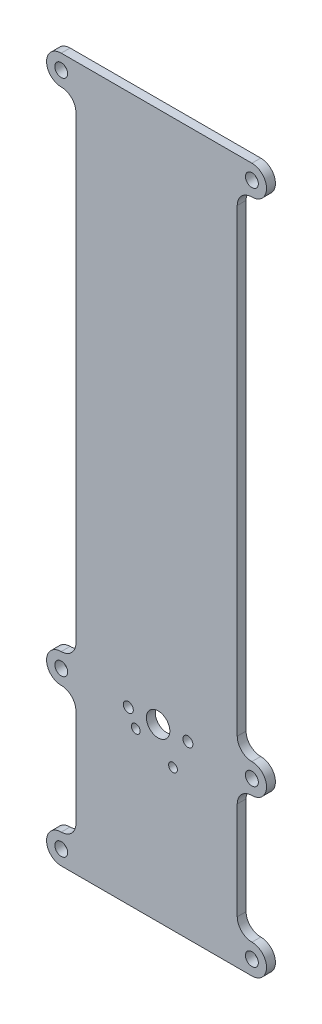
ISO-10303-21;
HEADER;
FILE_DESCRIPTION(('STEP AP214'),'2;1');
FILE_NAME('part.step','',(''),(''),'','','');
FILE_SCHEMA(('AUTOMOTIVE_DESIGN { 1 0 10303 214 1 1 1 1 }'));
ENDSEC;
DATA;
#1=APPLICATION_CONTEXT('core data for automotive mechanical design processes');
#2=APPLICATION_PROTOCOL_DEFINITION('international standard','automotive_design',2000,#1);
#3=PRODUCT_CONTEXT('',#1,'mechanical');
#4=PRODUCT('Part','Part','',(#3));
#5=PRODUCT_RELATED_PRODUCT_CATEGORY('part','',(#4));
#6=PRODUCT_DEFINITION_FORMATION('','',#4);
#7=PRODUCT_DEFINITION_CONTEXT('part definition',#1,'design');
#8=PRODUCT_DEFINITION('design','',#6,#7);
#9=PRODUCT_DEFINITION_SHAPE('','',#8);
#10=(LENGTH_UNIT() NAMED_UNIT(*) SI_UNIT(.MILLI.,.METRE.));
#11=(NAMED_UNIT(*) PLANE_ANGLE_UNIT() SI_UNIT($,.RADIAN.));
#12=(NAMED_UNIT(*) SI_UNIT($,.STERADIAN.) SOLID_ANGLE_UNIT());
#13=UNCERTAINTY_MEASURE_WITH_UNIT(LENGTH_MEASURE(1.E-05),#10,'distance_accuracy_value','');
#14=(GEOMETRIC_REPRESENTATION_CONTEXT(3) GLOBAL_UNCERTAINTY_ASSIGNED_CONTEXT((#13)) GLOBAL_UNIT_ASSIGNED_CONTEXT((#10,
#11,#12)) REPRESENTATION_CONTEXT('',''));
#15=CARTESIAN_POINT('',(0.,0.,0.));
#16=DIRECTION('',(0.,0.,1.));
#17=DIRECTION('',(1.,0.,0.));
#18=AXIS2_PLACEMENT_3D('',#15,#16,#17);
#19=CARTESIAN_POINT('',(136.512,-49.1938,-127.232909606827));
#20=DIRECTION('',(0.,0.,1.));
#21=DIRECTION('',(1.,0.,0.));
#22=AXIS2_PLACEMENT_3D('',#19,#20,#21);
#23=CYLINDRICAL_SURFACE('',#22,2.5);
#24=CARTESIAN_POINT('',(136.512,-49.1938,-1.51000000000001));
#25=DIRECTION('',(0.,0.,1.));
#26=DIRECTION('',(1.,0.,0.));
#27=AXIS2_PLACEMENT_3D('',#24,#25,#26);
#28=CIRCLE('',#27,2.5);
#29=CARTESIAN_POINT('',(136.512,-46.6938,-1.51000000000001));
#30=VERTEX_POINT('',#29);
#31=CARTESIAN_POINT('',(136.512,-51.6938,-1.51000000000001));
#32=VERTEX_POINT('',#31);
#33=EDGE_CURVE('E123',#30,#32,#28,.F.);
#34=ORIENTED_EDGE('',*,*,#33,.F.);
#35=DIRECTION('',(0.,0.,1.));
#36=VECTOR('',#35,1.);
#37=CARTESIAN_POINT('',(136.512,-46.6938,-127.232909606827));
#38=LINE('',#37,#36);
#39=CARTESIAN_POINT('',(136.512,-46.6938,0.));
#40=VERTEX_POINT('',#39);
#41=EDGE_CURVE('E199',#30,#40,#38,.T.);
#42=ORIENTED_EDGE('',*,*,#41,.T.);
#43=CARTESIAN_POINT('',(136.512,-49.1938,0.));
#44=DIRECTION('',(0.,0.,1.));
#45=DIRECTION('',(1.,0.,0.));
#46=AXIS2_PLACEMENT_3D('',#43,#44,#45);
#47=CIRCLE('',#46,2.5);
#48=CARTESIAN_POINT('',(136.512,-51.6938,0.));
#49=VERTEX_POINT('',#48);
#50=EDGE_CURVE('E202',#49,#40,#47,.T.);
#51=ORIENTED_EDGE('',*,*,#50,.F.);
#52=DIRECTION('',(0.,0.,1.));
#53=VECTOR('',#52,1.);
#54=CARTESIAN_POINT('',(136.512,-51.6938,-127.232909606827));
#55=LINE('',#54,#53);
#56=EDGE_CURVE('E192',#32,#49,#55,.T.);
#57=ORIENTED_EDGE('',*,*,#56,.F.);
#58=EDGE_LOOP('',(#34,#42,#51,#57));
#59=FACE_BOUND('',#58,.T.);
#60=ADVANCED_FACE('F45',(#59),#23,.T.);
#61=CARTESIAN_POINT('',(136.512,-46.6938,-127.232909606827));
#62=DIRECTION('',(0.,1.,0.));
#63=DIRECTION('',(-1.,0.,0.));
#64=AXIS2_PLACEMENT_3D('',#61,#62,#63);
#65=PLANE('',#64);
#66=DIRECTION('',(1.,0.,0.));
#67=VECTOR('',#66,1.);
#68=CARTESIAN_POINT('',(136.512,-46.6938,-1.51000000000001));
#69=LINE('',#68,#67);
#70=CARTESIAN_POINT('',(104.012,-46.6938,-1.51000000000001));
#71=VERTEX_POINT('',#70);
#72=EDGE_CURVE('E125',#71,#30,#69,.T.);
#73=ORIENTED_EDGE('',*,*,#72,.F.);
#74=DIRECTION('',(0.,0.,1.));
#75=VECTOR('',#74,1.);
#76=CARTESIAN_POINT('',(104.012,-46.6938,-127.232909606827));
#77=LINE('',#76,#75);
#78=CARTESIAN_POINT('',(104.012,-46.6938,0.));
#79=VERTEX_POINT('',#78);
#80=EDGE_CURVE('E337',#71,#79,#77,.T.);
#81=ORIENTED_EDGE('',*,*,#80,.T.);
#82=DIRECTION('',(-1.,0.,0.));
#83=VECTOR('',#82,1.);
#84=CARTESIAN_POINT('',(136.512,-46.6938,0.));
#85=LINE('',#84,#83);
#86=EDGE_CURVE('E207',#40,#79,#85,.T.);
#87=ORIENTED_EDGE('',*,*,#86,.F.);
#88=ORIENTED_EDGE('',*,*,#41,.F.);
#89=EDGE_LOOP('',(#73,#81,#87,#88));
#90=FACE_BOUND('',#89,.T.);
#91=ADVANCED_FACE('F499',(#90),#65,.T.);
#92=CARTESIAN_POINT('',(104.012,-49.1938,-127.232909606827));
#93=DIRECTION('',(0.,0.,1.));
#94=DIRECTION('',(1.,0.,0.));
#95=AXIS2_PLACEMENT_3D('',#92,#93,#94);
#96=CYLINDRICAL_SURFACE('',#95,2.5);
#97=CARTESIAN_POINT('',(104.012,-49.1938,-1.51000000000001));
#98=DIRECTION('',(0.,0.,1.));
#99=DIRECTION('',(1.,0.,0.));
#100=AXIS2_PLACEMENT_3D('',#97,#98,#99);
#101=CIRCLE('',#100,2.5);
#102=CARTESIAN_POINT('',(104.012,-51.6938,-1.51000000000001));
#103=VERTEX_POINT('',#102);
#104=EDGE_CURVE('E120',#103,#71,#101,.F.);
#105=ORIENTED_EDGE('',*,*,#104,.F.);
#106=DIRECTION('',(0.,0.,1.));
#107=VECTOR('',#106,1.);
#108=CARTESIAN_POINT('',(104.012,-51.6938,-127.232909606827));
#109=LINE('',#108,#107);
#110=CARTESIAN_POINT('',(104.012,-51.6938,0.));
#111=VERTEX_POINT('',#110);
#112=EDGE_CURVE('E334',#103,#111,#109,.T.);
#113=ORIENTED_EDGE('',*,*,#112,.T.);
#114=CARTESIAN_POINT('',(104.012,-49.1938,0.));
#115=DIRECTION('',(0.,0.,1.));
#116=DIRECTION('',(1.,0.,0.));
#117=AXIS2_PLACEMENT_3D('',#114,#115,#116);
#118=CIRCLE('',#117,2.5);
#119=EDGE_CURVE('E222',#79,#111,#118,.T.);
#120=ORIENTED_EDGE('',*,*,#119,.F.);
#121=ORIENTED_EDGE('',*,*,#80,.F.);
#122=EDGE_LOOP('',(#105,#113,#120,#121));
#123=FACE_BOUND('',#122,.T.);
#124=ADVANCED_FACE('F503',(#123),#96,.T.);
#125=CARTESIAN_POINT('',(104.01200016058,-54.19379983941,-127.232909606827));
#126=DIRECTION('',(0.,0.,1.));
#127=DIRECTION('',(1.,0.,0.));
#128=AXIS2_PLACEMENT_3D('',#125,#126,#127);
#129=CYLINDRICAL_SURFACE('',#128,2.49999983941251);
#130=CARTESIAN_POINT('',(104.01200016058,-54.19379983941,-1.51000000000001));
#131=DIRECTION('',(0.,0.,1.));
#132=DIRECTION('',(1.,0.,0.));
#133=AXIS2_PLACEMENT_3D('',#130,#131,#132);
#134=CIRCLE('',#133,2.49999983941251);
#135=CARTESIAN_POINT('',(106.511999999992,-54.19379983941,-1.51000000000001));
#136=VERTEX_POINT('',#135);
#137=EDGE_CURVE('E345',#136,#103,#134,.T.);
#138=ORIENTED_EDGE('',*,*,#137,.F.);
#139=DIRECTION('',(0.,0.,1.));
#140=VECTOR('',#139,1.);
#141=CARTESIAN_POINT('',(106.511999999992,-54.1938,-127.232909606827));
#142=LINE('',#141,#140);
#143=CARTESIAN_POINT('',(106.511999999992,-54.1938,0.));
#144=VERTEX_POINT('',#143);
#145=EDGE_CURVE('E331',#136,#144,#142,.T.);
#146=ORIENTED_EDGE('',*,*,#145,.T.);
#147=CARTESIAN_POINT('',(104.01200016058,-54.19379983941,0.));
#148=DIRECTION('',(0.,0.,-1.));
#149=DIRECTION('',(1.,0.,0.));
#150=AXIS2_PLACEMENT_3D('',#147,#148,#149);
#151=CIRCLE('',#150,2.49999983941251);
#152=EDGE_CURVE('E226',#111,#144,#151,.T.);
#153=ORIENTED_EDGE('',*,*,#152,.F.);
#154=ORIENTED_EDGE('',*,*,#112,.F.);
#155=EDGE_LOOP('',(#138,#146,#153,#154));
#156=FACE_BOUND('',#155,.T.);
#157=ADVANCED_FACE('F509',(#156),#129,.F.);
#158=CARTESIAN_POINT('',(106.511999999995,-54.1938,-127.232909606827));
#159=DIRECTION('',(-1.,0.,0.));
#160=DIRECTION('',(0.,-1.,0.));
#161=AXIS2_PLACEMENT_3D('',#158,#159,#160);
#162=PLANE('',#161);
#163=DIRECTION('',(0.,1.,0.));
#164=VECTOR('',#163,1.);
#165=CARTESIAN_POINT('',(106.511999999995,-54.1938,-1.51000000000001));
#166=LINE('',#165,#164);
#167=CARTESIAN_POINT('',(106.512,-132.541,-1.51000000000001));
#168=VERTEX_POINT('',#167);
#169=EDGE_CURVE('E348',#168,#136,#166,.T.);
#170=ORIENTED_EDGE('',*,*,#169,.F.);
#171=DIRECTION('',(0.,0.,1.));
#172=VECTOR('',#171,1.);
#173=CARTESIAN_POINT('',(106.512,-132.541,-127.232909606827));
#174=LINE('',#173,#172);
#175=CARTESIAN_POINT('',(106.512,-132.541,0.));
#176=VERTEX_POINT('',#175);
#177=EDGE_CURVE('E328',#168,#176,#174,.T.);
#178=ORIENTED_EDGE('',*,*,#177,.T.);
#179=DIRECTION('',(0.,-1.,0.));
#180=VECTOR('',#179,1.);
#181=CARTESIAN_POINT('',(106.511999999995,-54.1938,0.));
#182=LINE('',#181,#180);
#183=EDGE_CURVE('E230',#144,#176,#182,.T.);
#184=ORIENTED_EDGE('',*,*,#183,.F.);
#185=ORIENTED_EDGE('',*,*,#145,.F.);
#186=EDGE_LOOP('',(#170,#178,#184,#185));
#187=FACE_BOUND('',#186,.T.);
#188=ADVANCED_FACE('F513',(#187),#162,.T.);
#189=CARTESIAN_POINT('',(104.01200016058,-132.5410001605,-127.232909606827));
#190=DIRECTION('',(0.,0.,1.));
#191=DIRECTION('',(1.,0.,0.));
#192=AXIS2_PLACEMENT_3D('',#189,#190,#191);
#193=CYLINDRICAL_SURFACE('',#192,2.49999983944);
#194=CARTESIAN_POINT('',(104.01200016058,-132.5410001605,-1.51000000000001));
#195=DIRECTION('',(0.,0.,1.));
#196=DIRECTION('',(1.,0.,0.));
#197=AXIS2_PLACEMENT_3D('',#194,#195,#196);
#198=CIRCLE('',#197,2.49999983944);
#199=CARTESIAN_POINT('',(104.012,-135.04099999994,-1.51000000000001));
#200=VERTEX_POINT('',#199);
#201=EDGE_CURVE('E351',#200,#168,#198,.T.);
#202=ORIENTED_EDGE('',*,*,#201,.F.);
#203=DIRECTION('',(0.,0.,1.));
#204=VECTOR('',#203,1.);
#205=CARTESIAN_POINT('',(104.012,-135.04099999994,-127.232909606827));
#206=LINE('',#205,#204);
#207=CARTESIAN_POINT('',(104.012,-135.04099999994,0.));
#208=VERTEX_POINT('',#207);
#209=EDGE_CURVE('E325',#200,#208,#206,.T.);
#210=ORIENTED_EDGE('',*,*,#209,.T.);
#211=CARTESIAN_POINT('',(104.01200016058,-132.5410001605,0.));
#212=DIRECTION('',(0.,0.,-1.));
#213=DIRECTION('',(1.,0.,0.));
#214=AXIS2_PLACEMENT_3D('',#211,#212,#213);
#215=CIRCLE('',#214,2.49999983944);
#216=EDGE_CURVE('E234',#176,#208,#215,.T.);
#217=ORIENTED_EDGE('',*,*,#216,.F.);
#218=ORIENTED_EDGE('',*,*,#177,.F.);
#219=EDGE_LOOP('',(#202,#210,#217,#218));
#220=FACE_BOUND('',#219,.T.);
#221=ADVANCED_FACE('F517',(#220),#193,.F.);
#222=CARTESIAN_POINT('',(104.012,-137.541,-127.232909606827));
#223=DIRECTION('',(0.,0.,1.));
#224=DIRECTION('',(1.,0.,0.));
#225=AXIS2_PLACEMENT_3D('',#222,#223,#224);
#226=CYLINDRICAL_SURFACE('',#225,2.50000000002);
#227=CARTESIAN_POINT('',(104.012,-137.541,-1.51000000000001));
#228=DIRECTION('',(0.,0.,1.));
#229=DIRECTION('',(1.,0.,0.));
#230=AXIS2_PLACEMENT_3D('',#227,#228,#229);
#231=CIRCLE('',#230,2.50000000002);
#232=CARTESIAN_POINT('',(104.012,-140.04100000002,-1.51000000000001));
#233=VERTEX_POINT('',#232);
#234=EDGE_CURVE('E354',#233,#200,#231,.F.);
#235=ORIENTED_EDGE('',*,*,#234,.F.);
#236=DIRECTION('',(0.,0.,1.));
#237=VECTOR('',#236,1.);
#238=CARTESIAN_POINT('',(104.012,-140.04100000002,-127.232909606827));
#239=LINE('',#238,#237);
#240=CARTESIAN_POINT('',(104.012,-140.04100000002,0.));
#241=VERTEX_POINT('',#240);
#242=EDGE_CURVE('E322',#233,#241,#239,.T.);
#243=ORIENTED_EDGE('',*,*,#242,.T.);
#244=CARTESIAN_POINT('',(104.012,-137.541,0.));
#245=DIRECTION('',(0.,0.,1.));
#246=DIRECTION('',(1.,0.,0.));
#247=AXIS2_PLACEMENT_3D('',#244,#245,#246);
#248=CIRCLE('',#247,2.50000000002);
#249=EDGE_CURVE('E238',#208,#241,#248,.T.);
#250=ORIENTED_EDGE('',*,*,#249,.F.);
#251=ORIENTED_EDGE('',*,*,#209,.F.);
#252=EDGE_LOOP('',(#235,#243,#250,#251));
#253=FACE_BOUND('',#252,.T.);
#254=ADVANCED_FACE('F521',(#253),#226,.T.);
#255=CARTESIAN_POINT('',(104.01200016058,-142.5409998394,-127.232909606827));
#256=DIRECTION('',(0.,0.,1.));
#257=DIRECTION('',(1.,0.,0.));
#258=AXIS2_PLACEMENT_3D('',#255,#256,#257);
#259=CYLINDRICAL_SURFACE('',#258,2.49999983940502);
#260=CARTESIAN_POINT('',(104.01200016058,-142.5409998394,-1.51000000000001));
#261=DIRECTION('',(0.,0.,1.));
#262=DIRECTION('',(1.,0.,0.));
#263=AXIS2_PLACEMENT_3D('',#260,#261,#262);
#264=CIRCLE('',#263,2.49999983940502);
#265=CARTESIAN_POINT('',(106.511999999985,-142.5409998394,-1.51000000000001));
#266=VERTEX_POINT('',#265);
#267=EDGE_CURVE('E357',#266,#233,#264,.T.);
#268=ORIENTED_EDGE('',*,*,#267,.F.);
#269=DIRECTION('',(0.,0.,1.));
#270=VECTOR('',#269,1.);
#271=CARTESIAN_POINT('',(106.511999999985,-142.541,-127.232909606827));
#272=LINE('',#271,#270);
#273=CARTESIAN_POINT('',(106.511999999985,-142.541,0.));
#274=VERTEX_POINT('',#273);
#275=EDGE_CURVE('E319',#266,#274,#272,.T.);
#276=ORIENTED_EDGE('',*,*,#275,.T.);
#277=CARTESIAN_POINT('',(104.01200016058,-142.5409998394,0.));
#278=DIRECTION('',(0.,0.,-1.));
#279=DIRECTION('',(1.,0.,0.));
#280=AXIS2_PLACEMENT_3D('',#277,#278,#279);
#281=CIRCLE('',#280,2.49999983940502);
#282=EDGE_CURVE('E242',#241,#274,#281,.T.);
#283=ORIENTED_EDGE('',*,*,#282,.F.);
#284=ORIENTED_EDGE('',*,*,#242,.F.);
#285=EDGE_LOOP('',(#268,#276,#283,#284));
#286=FACE_BOUND('',#285,.T.);
#287=ADVANCED_FACE('F525',(#286),#259,.F.);
#288=CARTESIAN_POINT('',(106.51199999999,-142.541,-127.232909606827));
#289=DIRECTION('',(-1.,-6.0001964964609E-13,0.));
#290=DIRECTION('',(6.0001964964609E-13,-1.,0.));
#291=AXIS2_PLACEMENT_3D('',#288,#289,#290);
#292=PLANE('',#291);
#293=DIRECTION('',(-6.0001964964609E-13,1.,0.));
#294=VECTOR('',#293,1.);
#295=CARTESIAN_POINT('',(106.51199999999,-142.541,-1.51000000000001));
#296=LINE('',#295,#294);
#297=CARTESIAN_POINT('',(106.512,-159.1938,-1.51000000000001));
#298=VERTEX_POINT('',#297);
#299=EDGE_CURVE('E360',#298,#266,#296,.T.);
#300=ORIENTED_EDGE('',*,*,#299,.F.);
#301=DIRECTION('',(0.,0.,1.));
#302=VECTOR('',#301,1.);
#303=CARTESIAN_POINT('',(106.512,-159.1938,-127.232909606827));
#304=LINE('',#303,#302);
#305=CARTESIAN_POINT('',(106.512,-159.1938,0.));
#306=VERTEX_POINT('',#305);
#307=EDGE_CURVE('E316',#298,#306,#304,.T.);
#308=ORIENTED_EDGE('',*,*,#307,.T.);
#309=DIRECTION('',(6.0001964964609E-13,-1.,0.));
#310=VECTOR('',#309,1.);
#311=CARTESIAN_POINT('',(106.51199999999,-142.541,0.));
#312=LINE('',#311,#310);
#313=EDGE_CURVE('E246',#274,#306,#312,.T.);
#314=ORIENTED_EDGE('',*,*,#313,.F.);
#315=ORIENTED_EDGE('',*,*,#275,.F.);
#316=EDGE_LOOP('',(#300,#308,#314,#315));
#317=FACE_BOUND('',#316,.T.);
#318=ADVANCED_FACE('F529',(#317),#292,.T.);
#319=CARTESIAN_POINT('',(104.01200016058,-159.1938001605,-127.232909606827));
#320=DIRECTION('',(0.,0.,1.));
#321=DIRECTION('',(1.,0.,0.));
#322=AXIS2_PLACEMENT_3D('',#319,#320,#321);
#323=CYLINDRICAL_SURFACE('',#322,2.49999983944);
#324=CARTESIAN_POINT('',(104.01200016058,-159.1938001605,-1.51000000000001));
#325=DIRECTION('',(0.,0.,1.));
#326=DIRECTION('',(1.,0.,0.));
#327=AXIS2_PLACEMENT_3D('',#324,#325,#326);
#328=CIRCLE('',#327,2.49999983944);
#329=CARTESIAN_POINT('',(104.012,-161.69379999994,-1.51000000000001));
#330=VERTEX_POINT('',#329);
#331=EDGE_CURVE('E363',#330,#298,#328,.T.);
#332=ORIENTED_EDGE('',*,*,#331,.F.);
#333=DIRECTION('',(0.,0.,1.));
#334=VECTOR('',#333,1.);
#335=CARTESIAN_POINT('',(104.012,-161.69379999994,-127.232909606827));
#336=LINE('',#335,#334);
#337=CARTESIAN_POINT('',(104.012,-161.69379999994,0.));
#338=VERTEX_POINT('',#337);
#339=EDGE_CURVE('E313',#330,#338,#336,.T.);
#340=ORIENTED_EDGE('',*,*,#339,.T.);
#341=CARTESIAN_POINT('',(104.01200016058,-159.1938001605,0.));
#342=DIRECTION('',(0.,0.,-1.));
#343=DIRECTION('',(1.,0.,0.));
#344=AXIS2_PLACEMENT_3D('',#341,#342,#343);
#345=CIRCLE('',#344,2.49999983944);
#346=EDGE_CURVE('E250',#306,#338,#345,.T.);
#347=ORIENTED_EDGE('',*,*,#346,.F.);
#348=ORIENTED_EDGE('',*,*,#307,.F.);
#349=EDGE_LOOP('',(#332,#340,#347,#348));
#350=FACE_BOUND('',#349,.T.);
#351=ADVANCED_FACE('F533',(#350),#323,.F.);
#352=CARTESIAN_POINT('',(104.012,-164.1938,-127.232909606827));
#353=DIRECTION('',(0.,0.,1.));
#354=DIRECTION('',(1.,0.,0.));
#355=AXIS2_PLACEMENT_3D('',#352,#353,#354);
#356=CYLINDRICAL_SURFACE('',#355,2.50000000002);
#357=CARTESIAN_POINT('',(104.012,-164.1938,-1.51000000000001));
#358=DIRECTION('',(0.,0.,1.));
#359=DIRECTION('',(1.,0.,0.));
#360=AXIS2_PLACEMENT_3D('',#357,#358,#359);
#361=CIRCLE('',#360,2.50000000002);
#362=CARTESIAN_POINT('',(104.012,-166.69380000002,-1.51000000000001));
#363=VERTEX_POINT('',#362);
#364=EDGE_CURVE('E366',#363,#330,#361,.F.);
#365=ORIENTED_EDGE('',*,*,#364,.F.);
#366=DIRECTION('',(0.,0.,1.));
#367=VECTOR('',#366,1.);
#368=CARTESIAN_POINT('',(104.012,-166.69380000002,-127.232909606827));
#369=LINE('',#368,#367);
#370=CARTESIAN_POINT('',(104.012,-166.69380000002,0.));
#371=VERTEX_POINT('',#370);
#372=EDGE_CURVE('E310',#363,#371,#369,.T.);
#373=ORIENTED_EDGE('',*,*,#372,.T.);
#374=CARTESIAN_POINT('',(104.012,-164.1938,0.));
#375=DIRECTION('',(0.,0.,1.));
#376=DIRECTION('',(1.,0.,0.));
#377=AXIS2_PLACEMENT_3D('',#374,#375,#376);
#378=CIRCLE('',#377,2.50000000002);
#379=EDGE_CURVE('E254',#338,#371,#378,.T.);
#380=ORIENTED_EDGE('',*,*,#379,.F.);
#381=ORIENTED_EDGE('',*,*,#339,.F.);
#382=EDGE_LOOP('',(#365,#373,#380,#381));
#383=FACE_BOUND('',#382,.T.);
#384=ADVANCED_FACE('F537',(#383),#356,.T.);
#385=CARTESIAN_POINT('',(104.012,-166.6938,-127.232909606827));
#386=DIRECTION('',(0.,-1.,0.));
#387=DIRECTION('',(0.,0.,-1.));
#388=AXIS2_PLACEMENT_3D('',#385,#386,#387);
#389=PLANE('',#388);
#390=DIRECTION('',(-1.,0.,0.));
#391=VECTOR('',#390,1.);
#392=CARTESIAN_POINT('',(104.012,-166.6938,-1.51000000000001));
#393=LINE('',#392,#391);
#394=CARTESIAN_POINT('',(136.512,-166.6938,-1.51000000000001));
#395=VERTEX_POINT('',#394);
#396=EDGE_CURVE('E369',#395,#363,#393,.T.);
#397=ORIENTED_EDGE('',*,*,#396,.F.);
#398=DIRECTION('',(0.,0.,1.));
#399=VECTOR('',#398,1.);
#400=CARTESIAN_POINT('',(136.512,-166.6938,-127.232909606827));
#401=LINE('',#400,#399);
#402=CARTESIAN_POINT('',(136.512,-166.6938,0.));
#403=VERTEX_POINT('',#402);
#404=EDGE_CURVE('E307',#395,#403,#401,.T.);
#405=ORIENTED_EDGE('',*,*,#404,.T.);
#406=DIRECTION('',(1.,0.,0.));
#407=VECTOR('',#406,1.);
#408=CARTESIAN_POINT('',(104.012,-166.6938,0.));
#409=LINE('',#408,#407);
#410=EDGE_CURVE('E258',#371,#403,#409,.T.);
#411=ORIENTED_EDGE('',*,*,#410,.F.);
#412=ORIENTED_EDGE('',*,*,#372,.F.);
#413=EDGE_LOOP('',(#397,#405,#411,#412));
#414=FACE_BOUND('',#413,.T.);
#415=ADVANCED_FACE('F541',(#414),#389,.T.);
#416=CARTESIAN_POINT('',(136.512,-164.1938,-127.232909606827));
#417=DIRECTION('',(0.,0.,1.));
#418=DIRECTION('',(1.,0.,0.));
#419=AXIS2_PLACEMENT_3D('',#416,#417,#418);
#420=CYLINDRICAL_SURFACE('',#419,2.5);
#421=CARTESIAN_POINT('',(136.512,-164.1938,-1.51000000000001));
#422=DIRECTION('',(0.,0.,1.));
#423=DIRECTION('',(1.,0.,0.));
#424=AXIS2_PLACEMENT_3D('',#421,#422,#423);
#425=CIRCLE('',#424,2.5);
#426=CARTESIAN_POINT('',(136.512,-161.6938,-1.51000000000001));
#427=VERTEX_POINT('',#426);
#428=EDGE_CURVE('E372',#427,#395,#425,.F.);
#429=ORIENTED_EDGE('',*,*,#428,.F.);
#430=DIRECTION('',(0.,0.,1.));
#431=VECTOR('',#430,1.);
#432=CARTESIAN_POINT('',(136.512,-161.6938,-127.232909606827));
#433=LINE('',#432,#431);
#434=CARTESIAN_POINT('',(136.512,-161.6938,0.));
#435=VERTEX_POINT('',#434);
#436=EDGE_CURVE('E304',#427,#435,#433,.T.);
#437=ORIENTED_EDGE('',*,*,#436,.T.);
#438=CARTESIAN_POINT('',(136.512,-164.1938,0.));
#439=DIRECTION('',(0.,0.,1.));
#440=DIRECTION('',(1.,0.,0.));
#441=AXIS2_PLACEMENT_3D('',#438,#439,#440);
#442=CIRCLE('',#441,2.5);
#443=EDGE_CURVE('E262',#403,#435,#442,.T.);
#444=ORIENTED_EDGE('',*,*,#443,.F.);
#445=ORIENTED_EDGE('',*,*,#404,.F.);
#446=EDGE_LOOP('',(#429,#437,#444,#445));
#447=FACE_BOUND('',#446,.T.);
#448=ADVANCED_FACE('F545',(#447),#420,.T.);
#449=CARTESIAN_POINT('',(136.51199983941,-159.1938001605,-127.232909606827));
#450=DIRECTION('',(0.,0.,1.));
#451=DIRECTION('',(1.,0.,0.));
#452=AXIS2_PLACEMENT_3D('',#449,#450,#451);
#453=CYLINDRICAL_SURFACE('',#452,2.49999983947751);
#454=CARTESIAN_POINT('',(136.51199983941,-159.1938001605,-1.51000000000001));
#455=DIRECTION('',(0.,0.,1.));
#456=DIRECTION('',(1.,0.,0.));
#457=AXIS2_PLACEMENT_3D('',#454,#455,#456);
#458=CIRCLE('',#457,2.49999983947751);
#459=CARTESIAN_POINT('',(134.011999999933,-159.1938,-1.51000000000001));
#460=VERTEX_POINT('',#459);
#461=EDGE_CURVE('E375',#460,#427,#458,.T.);
#462=ORIENTED_EDGE('',*,*,#461,.F.);
#463=DIRECTION('',(0.,0.,1.));
#464=VECTOR('',#463,1.);
#465=CARTESIAN_POINT('',(134.011999999933,-159.1938,-127.232909606827));
#466=LINE('',#465,#464);
#467=CARTESIAN_POINT('',(134.011999999933,-159.1938,0.));
#468=VERTEX_POINT('',#467);
#469=EDGE_CURVE('E301',#460,#468,#466,.T.);
#470=ORIENTED_EDGE('',*,*,#469,.T.);
#471=CARTESIAN_POINT('',(136.51199983941,-159.1938001605,0.));
#472=DIRECTION('',(0.,0.,-1.));
#473=DIRECTION('',(1.,0.,0.));
#474=AXIS2_PLACEMENT_3D('',#471,#472,#473);
#475=CIRCLE('',#474,2.49999983947751);
#476=EDGE_CURVE('E266',#435,#468,#475,.T.);
#477=ORIENTED_EDGE('',*,*,#476,.F.);
#478=ORIENTED_EDGE('',*,*,#436,.F.);
#479=EDGE_LOOP('',(#462,#470,#477,#478));
#480=FACE_BOUND('',#479,.T.);
#481=ADVANCED_FACE('F549',(#480),#453,.F.);
#482=CARTESIAN_POINT('',(134.011999999955,-159.1938,-127.232909606827));
#483=DIRECTION('',(1.,-2.70175514465642E-12,0.));
#484=DIRECTION('',(2.70175514465642E-12,1.,0.));
#485=AXIS2_PLACEMENT_3D('',#482,#483,#484);
#486=PLANE('',#485);
#487=DIRECTION('',(-2.70175514465642E-12,-1.,0.));
#488=VECTOR('',#487,1.);
#489=CARTESIAN_POINT('',(134.011999999955,-159.1938,-1.51000000000001));
#490=LINE('',#489,#488);
#491=CARTESIAN_POINT('',(134.012,-142.541,-1.51000000000001));
#492=VERTEX_POINT('',#491);
#493=EDGE_CURVE('E378',#492,#460,#490,.T.);
#494=ORIENTED_EDGE('',*,*,#493,.F.);
#495=DIRECTION('',(0.,0.,1.));
#496=VECTOR('',#495,1.);
#497=CARTESIAN_POINT('',(134.012,-142.541,-127.232909606827));
#498=LINE('',#497,#496);
#499=CARTESIAN_POINT('',(134.012,-142.541,0.));
#500=VERTEX_POINT('',#499);
#501=EDGE_CURVE('E298',#492,#500,#498,.T.);
#502=ORIENTED_EDGE('',*,*,#501,.T.);
#503=DIRECTION('',(2.70175514465642E-12,1.,0.));
#504=VECTOR('',#503,1.);
#505=CARTESIAN_POINT('',(134.011999999955,-159.1938,0.));
#506=LINE('',#505,#504);
#507=EDGE_CURVE('E270',#468,#500,#506,.T.);
#508=ORIENTED_EDGE('',*,*,#507,.F.);
#509=ORIENTED_EDGE('',*,*,#469,.F.);
#510=EDGE_LOOP('',(#494,#502,#508,#509));
#511=FACE_BOUND('',#510,.T.);
#512=ADVANCED_FACE('F553',(#511),#486,.T.);
#513=CARTESIAN_POINT('',(136.51199983941,-142.5409998394,-127.232909606827));
#514=DIRECTION('',(0.,0.,1.));
#515=DIRECTION('',(1.,0.,0.));
#516=AXIS2_PLACEMENT_3D('',#513,#514,#515);
#517=CYLINDRICAL_SURFACE('',#516,2.49999983940752);
#518=CARTESIAN_POINT('',(136.51199983941,-142.5409998394,-1.51000000000001));
#519=DIRECTION('',(0.,0.,1.));
#520=DIRECTION('',(1.,0.,0.));
#521=AXIS2_PLACEMENT_3D('',#518,#519,#520);
#522=CIRCLE('',#521,2.49999983940752);
#523=CARTESIAN_POINT('',(136.512,-140.040999999992,-1.51000000000001));
#524=VERTEX_POINT('',#523);
#525=EDGE_CURVE('E381',#524,#492,#522,.T.);
#526=ORIENTED_EDGE('',*,*,#525,.F.);
#527=DIRECTION('',(0.,0.,1.));
#528=VECTOR('',#527,1.);
#529=CARTESIAN_POINT('',(136.512,-140.040999999992,-127.232909606827));
#530=LINE('',#529,#528);
#531=CARTESIAN_POINT('',(136.512,-140.040999999992,0.));
#532=VERTEX_POINT('',#531);
#533=EDGE_CURVE('E295',#524,#532,#530,.T.);
#534=ORIENTED_EDGE('',*,*,#533,.T.);
#535=CARTESIAN_POINT('',(136.51199983941,-142.5409998394,0.));
#536=DIRECTION('',(0.,0.,-1.));
#537=DIRECTION('',(1.,0.,0.));
#538=AXIS2_PLACEMENT_3D('',#535,#536,#537);
#539=CIRCLE('',#538,2.49999983940752);
#540=EDGE_CURVE('E274',#500,#532,#539,.T.);
#541=ORIENTED_EDGE('',*,*,#540,.F.);
#542=ORIENTED_EDGE('',*,*,#501,.F.);
#543=EDGE_LOOP('',(#526,#534,#541,#542));
#544=FACE_BOUND('',#543,.T.);
#545=ADVANCED_FACE('F557',(#544),#517,.F.);
#546=CARTESIAN_POINT('',(136.512,-137.541,-127.232909606827));
#547=DIRECTION('',(0.,0.,1.));
#548=DIRECTION('',(1.,0.,0.));
#549=AXIS2_PLACEMENT_3D('',#546,#547,#548);
#550=CYLINDRICAL_SURFACE('',#549,2.4999999999975);
#551=CARTESIAN_POINT('',(136.512,-137.541,-1.51000000000001));
#552=DIRECTION('',(0.,0.,1.));
#553=DIRECTION('',(1.,0.,0.));
#554=AXIS2_PLACEMENT_3D('',#551,#552,#553);
#555=CIRCLE('',#554,2.4999999999975);
#556=CARTESIAN_POINT('',(136.512,-135.041000000002,-1.51000000000001));
#557=VERTEX_POINT('',#556);
#558=EDGE_CURVE('E384',#557,#524,#555,.F.);
#559=ORIENTED_EDGE('',*,*,#558,.F.);
#560=DIRECTION('',(0.,0.,1.));
#561=VECTOR('',#560,1.);
#562=CARTESIAN_POINT('',(136.512,-135.041000000002,-127.232909606827));
#563=LINE('',#562,#561);
#564=CARTESIAN_POINT('',(136.512,-135.041000000002,0.));
#565=VERTEX_POINT('',#564);
#566=EDGE_CURVE('E292',#557,#565,#563,.T.);
#567=ORIENTED_EDGE('',*,*,#566,.T.);
#568=CARTESIAN_POINT('',(136.512,-137.541,0.));
#569=DIRECTION('',(0.,0.,1.));
#570=DIRECTION('',(1.,0.,0.));
#571=AXIS2_PLACEMENT_3D('',#568,#569,#570);
#572=CIRCLE('',#571,2.4999999999975);
#573=EDGE_CURVE('E278',#532,#565,#572,.T.);
#574=ORIENTED_EDGE('',*,*,#573,.F.);
#575=ORIENTED_EDGE('',*,*,#533,.F.);
#576=EDGE_LOOP('',(#559,#567,#574,#575));
#577=FACE_BOUND('',#576,.T.);
#578=ADVANCED_FACE('F561',(#577),#550,.T.);
#579=CARTESIAN_POINT('',(136.51199983941,-132.5410001605,-127.232909606827));
#580=DIRECTION('',(0.,0.,1.));
#581=DIRECTION('',(1.,0.,0.));
#582=AXIS2_PLACEMENT_3D('',#579,#580,#581);
#583=CYLINDRICAL_SURFACE('',#582,2.49999983947751);
#584=CARTESIAN_POINT('',(136.51199983941,-132.5410001605,-1.51000000000001));
#585=DIRECTION('',(0.,0.,1.));
#586=DIRECTION('',(1.,0.,0.));
#587=AXIS2_PLACEMENT_3D('',#584,#585,#586);
#588=CIRCLE('',#587,2.49999983947751);
#589=CARTESIAN_POINT('',(134.011999999933,-132.541,-1.51000000000001));
#590=VERTEX_POINT('',#589);
#591=EDGE_CURVE('E387',#590,#557,#588,.T.);
#592=ORIENTED_EDGE('',*,*,#591,.F.);
#593=DIRECTION('',(0.,0.,1.));
#594=VECTOR('',#593,1.);
#595=CARTESIAN_POINT('',(134.011999999933,-132.541,-127.232909606827));
#596=LINE('',#595,#594);
#597=CARTESIAN_POINT('',(134.011999999933,-132.541,0.));
#598=VERTEX_POINT('',#597);
#599=EDGE_CURVE('E289',#590,#598,#596,.T.);
#600=ORIENTED_EDGE('',*,*,#599,.T.);
#601=CARTESIAN_POINT('',(136.51199983941,-132.5410001605,0.));
#602=DIRECTION('',(0.,0.,-1.));
#603=DIRECTION('',(1.,0.,0.));
#604=AXIS2_PLACEMENT_3D('',#601,#602,#603);
#605=CIRCLE('',#604,2.49999983947751);
#606=EDGE_CURVE('E282',#565,#598,#605,.T.);
#607=ORIENTED_EDGE('',*,*,#606,.F.);
#608=ORIENTED_EDGE('',*,*,#566,.F.);
#609=EDGE_LOOP('',(#592,#600,#607,#608));
#610=FACE_BOUND('',#609,.T.);
#611=ADVANCED_FACE('F565',(#610),#583,.F.);
#612=CARTESIAN_POINT('',(134.011999999955,-132.541,-127.232909606827));
#613=DIRECTION('',(1.,-5.74261595474177E-13,0.));
#614=DIRECTION('',(5.74261595474177E-13,1.,0.));
#615=AXIS2_PLACEMENT_3D('',#612,#613,#614);
#616=PLANE('',#615);
#617=DIRECTION('',(-5.74261595474177E-13,-1.,0.));
#618=VECTOR('',#617,1.);
#619=CARTESIAN_POINT('',(134.011999999955,-132.541,-1.51000000000001));
#620=LINE('',#619,#618);
#621=CARTESIAN_POINT('',(134.012,-54.1938,-1.51000000000001));
#622=VERTEX_POINT('',#621);
#623=EDGE_CURVE('E390',#622,#590,#620,.T.);
#624=ORIENTED_EDGE('',*,*,#623,.F.);
#625=DIRECTION('',(0.,0.,1.));
#626=VECTOR('',#625,1.);
#627=CARTESIAN_POINT('',(134.012,-54.1938,-127.232909606827));
#628=LINE('',#627,#626);
#629=CARTESIAN_POINT('',(134.012,-54.1938,0.));
#630=VERTEX_POINT('',#629);
#631=EDGE_CURVE('E132',#622,#630,#628,.T.);
#632=ORIENTED_EDGE('',*,*,#631,.T.);
#633=DIRECTION('',(5.74261595474177E-13,1.,0.));
#634=VECTOR('',#633,1.);
#635=CARTESIAN_POINT('',(134.011999999955,-132.541,0.));
#636=LINE('',#635,#634);
#637=EDGE_CURVE('E200',#598,#630,#636,.T.);
#638=ORIENTED_EDGE('',*,*,#637,.F.);
#639=ORIENTED_EDGE('',*,*,#599,.F.);
#640=EDGE_LOOP('',(#624,#632,#638,#639));
#641=FACE_BOUND('',#640,.T.);
#642=ADVANCED_FACE('F497',(#641),#616,.T.);
#643=CARTESIAN_POINT('',(136.51199983941,-54.19379983941,-127.232909606827));
#644=DIRECTION('',(0.,0.,1.));
#645=DIRECTION('',(1.,0.,0.));
#646=AXIS2_PLACEMENT_3D('',#643,#644,#645);
#647=CYLINDRICAL_SURFACE('',#646,2.49999983941001);
#648=CARTESIAN_POINT('',(136.51199983941,-54.19379983941,-1.51000000000001));
#649=DIRECTION('',(0.,0.,1.));
#650=DIRECTION('',(1.,0.,0.));
#651=AXIS2_PLACEMENT_3D('',#648,#649,#650);
#652=CIRCLE('',#651,2.49999983941001);
#653=EDGE_CURVE('E65',#32,#622,#652,.T.);
#654=ORIENTED_EDGE('',*,*,#653,.F.);
#655=ORIENTED_EDGE('',*,*,#56,.T.);
#656=CARTESIAN_POINT('',(136.51199983941,-54.19379983941,0.));
#657=DIRECTION('',(0.,0.,-1.));
#658=DIRECTION('',(1.,0.,0.));
#659=AXIS2_PLACEMENT_3D('',#656,#657,#658);
#660=CIRCLE('',#659,2.49999983941001);
#661=EDGE_CURVE('E195',#630,#49,#660,.T.);
#662=ORIENTED_EDGE('',*,*,#661,.F.);
#663=ORIENTED_EDGE('',*,*,#631,.F.);
#664=EDGE_LOOP('',(#654,#655,#662,#663));
#665=FACE_BOUND('',#664,.T.);
#666=ADVANCED_FACE('F47',(#665),#647,.F.);
#667=CARTESIAN_POINT('',(125.603,-137.541,-127.232909606827));
#668=DIRECTION('',(0.,0.,1.));
#669=DIRECTION('',(1.,0.,0.));
#670=AXIS2_PLACEMENT_3D('',#667,#668,#669);
#671=CYLINDRICAL_SURFACE('',#670,0.849999999999977);
#672=CARTESIAN_POINT('',(125.603,-137.541,-1.51000000000001));
#673=DIRECTION('',(0.,0.,1.));
#674=DIRECTION('',(1.,0.,0.));
#675=AXIS2_PLACEMENT_3D('',#672,#673,#674);
#676=CIRCLE('',#675,0.849999999999977);
#677=CARTESIAN_POINT('',(126.453,-137.541,-1.51000000000001));
#678=VERTEX_POINT('',#677);
#679=EDGE_CURVE('E11',#678,#678,#676,.F.);
#680=ORIENTED_EDGE('',*,*,#679,.T.);
#681=EDGE_LOOP('',(#680));
#682=FACE_BOUND('',#681,.T.);
#683=CARTESIAN_POINT('',(125.603,-137.541,0.));
#684=DIRECTION('',(0.,0.,1.));
#685=DIRECTION('',(1.,0.,0.));
#686=AXIS2_PLACEMENT_3D('',#683,#684,#685);
#687=CIRCLE('',#686,0.849999999999977);
#688=CARTESIAN_POINT('',(126.453,-137.541,0.));
#689=VERTEX_POINT('',#688);
#690=EDGE_CURVE('E212',#689,#689,#687,.T.);
#691=ORIENTED_EDGE('',*,*,#690,.T.);
#692=EDGE_LOOP('',(#691));
#693=FACE_BOUND('',#692,.T.);
#694=ADVANCED_FACE('F486',(#682,#693),#671,.F.);
#695=CARTESIAN_POINT('',(120.523,-137.541,-127.232909606827));
#696=DIRECTION('',(0.,0.,1.));
#697=DIRECTION('',(1.,0.,0.));
#698=AXIS2_PLACEMENT_3D('',#695,#696,#697);
#699=CYLINDRICAL_SURFACE('',#698,2.);
#700=CARTESIAN_POINT('',(120.523,-137.541,-1.51000000000001));
#701=DIRECTION('',(0.,0.,1.));
#702=DIRECTION('',(1.,0.,0.));
#703=AXIS2_PLACEMENT_3D('',#700,#701,#702);
#704=CIRCLE('',#703,2.);
#705=CARTESIAN_POINT('',(122.523,-137.541,-1.51000000000001));
#706=VERTEX_POINT('',#705);
#707=EDGE_CURVE('E397',#706,#706,#704,.F.);
#708=ORIENTED_EDGE('',*,*,#707,.T.);
#709=EDGE_LOOP('',(#708));
#710=FACE_BOUND('',#709,.T.);
#711=CARTESIAN_POINT('',(120.523,-137.541,0.));
#712=DIRECTION('',(0.,0.,1.));
#713=DIRECTION('',(1.,0.,0.));
#714=AXIS2_PLACEMENT_3D('',#711,#712,#713);
#715=CIRCLE('',#714,2.);
#716=CARTESIAN_POINT('',(122.523,-137.541,0.));
#717=VERTEX_POINT('',#716);
#718=EDGE_CURVE('E216',#717,#717,#715,.T.);
#719=ORIENTED_EDGE('',*,*,#718,.T.);
#720=EDGE_LOOP('',(#719));
#721=FACE_BOUND('',#720,.T.);
#722=ADVANCED_FACE('F476',(#710,#721),#699,.F.);
#723=CARTESIAN_POINT('',(115.443,-137.541,-127.232909606827));
#724=DIRECTION('',(0.,0.,1.));
#725=DIRECTION('',(1.,0.,0.));
#726=AXIS2_PLACEMENT_3D('',#723,#724,#725);
#727=CYLINDRICAL_SURFACE('',#726,0.84999999999999);
#728=CARTESIAN_POINT('',(115.443,-137.541,-1.51000000000001));
#729=DIRECTION('',(0.,0.,1.));
#730=DIRECTION('',(1.,0.,0.));
#731=AXIS2_PLACEMENT_3D('',#728,#729,#730);
#732=CIRCLE('',#731,0.84999999999999);
#733=CARTESIAN_POINT('',(116.293,-137.541,-1.51000000000001));
#734=VERTEX_POINT('',#733);
#735=EDGE_CURVE('E56',#734,#734,#732,.F.);
#736=ORIENTED_EDGE('',*,*,#735,.T.);
#737=EDGE_LOOP('',(#736));
#738=FACE_BOUND('',#737,.T.);
#739=CARTESIAN_POINT('',(115.443,-137.541,0.));
#740=DIRECTION('',(0.,0.,1.));
#741=DIRECTION('',(1.,0.,0.));
#742=AXIS2_PLACEMENT_3D('',#739,#740,#741);
#743=CIRCLE('',#742,0.84999999999999);
#744=CARTESIAN_POINT('',(116.293,-137.541,0.));
#745=VERTEX_POINT('',#744);
#746=EDGE_CURVE('E469',#745,#745,#743,.T.);
#747=ORIENTED_EDGE('',*,*,#746,.T.);
#748=EDGE_LOOP('',(#747));
#749=FACE_BOUND('',#748,.T.);
#750=ADVANCED_FACE('F494',(#738,#749),#727,.F.);
#751=CARTESIAN_POINT('',(116.713,-140.081,-127.232909606827));
#752=DIRECTION('',(0.,0.,1.));
#753=DIRECTION('',(1.,0.,0.));
#754=AXIS2_PLACEMENT_3D('',#751,#752,#753);
#755=CYLINDRICAL_SURFACE('',#754,0.749999999999999);
#756=CARTESIAN_POINT('',(116.713,-140.081,-1.51000000000001));
#757=DIRECTION('',(0.,0.,1.));
#758=DIRECTION('',(1.,0.,0.));
#759=AXIS2_PLACEMENT_3D('',#756,#757,#758);
#760=CIRCLE('',#759,0.749999999999999);
#761=CARTESIAN_POINT('',(117.463,-140.081,-1.51000000000001));
#762=VERTEX_POINT('',#761);
#763=EDGE_CURVE('E401',#762,#762,#760,.F.);
#764=ORIENTED_EDGE('',*,*,#763,.T.);
#765=EDGE_LOOP('',(#764));
#766=FACE_BOUND('',#765,.T.);
#767=CARTESIAN_POINT('',(116.713,-140.081,0.));
#768=DIRECTION('',(0.,0.,1.));
#769=DIRECTION('',(1.,0.,0.));
#770=AXIS2_PLACEMENT_3D('',#767,#768,#769);
#771=CIRCLE('',#770,0.749999999999999);
#772=CARTESIAN_POINT('',(117.463,-140.081,0.));
#773=VERTEX_POINT('',#772);
#774=EDGE_CURVE('E465',#773,#773,#771,.T.);
#775=ORIENTED_EDGE('',*,*,#774,.T.);
#776=EDGE_LOOP('',(#775));
#777=FACE_BOUND('',#776,.T.);
#778=ADVANCED_FACE('F650',(#766,#777),#755,.F.);
#779=CARTESIAN_POINT('',(123.063,-142.621,-127.232909606827));
#780=DIRECTION('',(0.,0.,1.));
#781=DIRECTION('',(1.,0.,0.));
#782=AXIS2_PLACEMENT_3D('',#779,#780,#781);
#783=CYLINDRICAL_SURFACE('',#782,0.749999999999999);
#784=CARTESIAN_POINT('',(123.063,-142.621,-1.51000000000001));
#785=DIRECTION('',(0.,0.,1.));
#786=DIRECTION('',(1.,0.,0.));
#787=AXIS2_PLACEMENT_3D('',#784,#785,#786);
#788=CIRCLE('',#787,0.749999999999999);
#789=CARTESIAN_POINT('',(123.813,-142.621,-1.51000000000001));
#790=VERTEX_POINT('',#789);
#791=EDGE_CURVE('E427',#790,#790,#788,.F.);
#792=ORIENTED_EDGE('',*,*,#791,.T.);
#793=EDGE_LOOP('',(#792));
#794=FACE_BOUND('',#793,.T.);
#795=CARTESIAN_POINT('',(123.063,-142.621,0.));
#796=DIRECTION('',(0.,0.,1.));
#797=DIRECTION('',(1.,0.,0.));
#798=AXIS2_PLACEMENT_3D('',#795,#796,#797);
#799=CIRCLE('',#798,0.749999999999999);
#800=CARTESIAN_POINT('',(123.813,-142.621,0.));
#801=VERTEX_POINT('',#800);
#802=EDGE_CURVE('E461',#801,#801,#799,.T.);
#803=ORIENTED_EDGE('',*,*,#802,.T.);
#804=EDGE_LOOP('',(#803));
#805=FACE_BOUND('',#804,.T.);
#806=ADVANCED_FACE('F646',(#794,#805),#783,.F.);
#807=CARTESIAN_POINT('',(104.012,-137.541,-127.232909606827));
#808=DIRECTION('',(0.,0.,1.));
#809=DIRECTION('',(1.,0.,0.));
#810=AXIS2_PLACEMENT_3D('',#807,#808,#809);
#811=CYLINDRICAL_SURFACE('',#810,1.09999999999999);
#812=CARTESIAN_POINT('',(104.012,-137.541,-1.51000000000001));
#813=DIRECTION('',(0.,0.,1.));
#814=DIRECTION('',(1.,0.,0.));
#815=AXIS2_PLACEMENT_3D('',#812,#813,#814);
#816=CIRCLE('',#815,1.09999999999999);
#817=CARTESIAN_POINT('',(105.112,-137.541,-1.51000000000001));
#818=VERTEX_POINT('',#817);
#819=EDGE_CURVE('E405',#818,#818,#816,.F.);
#820=ORIENTED_EDGE('',*,*,#819,.T.);
#821=EDGE_LOOP('',(#820));
#822=FACE_BOUND('',#821,.T.);
#823=CARTESIAN_POINT('',(104.012,-137.541,0.));
#824=DIRECTION('',(0.,0.,1.));
#825=DIRECTION('',(1.,0.,0.));
#826=AXIS2_PLACEMENT_3D('',#823,#824,#825);
#827=CIRCLE('',#826,1.09999999999999);
#828=CARTESIAN_POINT('',(105.112,-137.541,0.));
#829=VERTEX_POINT('',#828);
#830=EDGE_CURVE('E457',#829,#829,#827,.T.);
#831=ORIENTED_EDGE('',*,*,#830,.T.);
#832=EDGE_LOOP('',(#831));
#833=FACE_BOUND('',#832,.T.);
#834=ADVANCED_FACE('F649',(#822,#833),#811,.F.);
#835=CARTESIAN_POINT('',(104.012,-164.1938,-127.232909606827));
#836=DIRECTION('',(0.,0.,1.));
#837=DIRECTION('',(1.,0.,0.));
#838=AXIS2_PLACEMENT_3D('',#835,#836,#837);
#839=CYLINDRICAL_SURFACE('',#838,1.09999999999999);
#840=CARTESIAN_POINT('',(104.012,-164.1938,-1.51000000000001));
#841=DIRECTION('',(0.,0.,1.));
#842=DIRECTION('',(1.,0.,0.));
#843=AXIS2_PLACEMENT_3D('',#840,#841,#842);
#844=CIRCLE('',#843,1.09999999999999);
#845=CARTESIAN_POINT('',(105.112,-164.1938,-1.51000000000001));
#846=VERTEX_POINT('',#845);
#847=EDGE_CURVE('E423',#846,#846,#844,.F.);
#848=ORIENTED_EDGE('',*,*,#847,.T.);
#849=EDGE_LOOP('',(#848));
#850=FACE_BOUND('',#849,.T.);
#851=CARTESIAN_POINT('',(104.012,-164.1938,0.));
#852=DIRECTION('',(0.,0.,1.));
#853=DIRECTION('',(1.,0.,0.));
#854=AXIS2_PLACEMENT_3D('',#851,#852,#853);
#855=CIRCLE('',#854,1.09999999999999);
#856=CARTESIAN_POINT('',(105.112,-164.1938,0.));
#857=VERTEX_POINT('',#856);
#858=EDGE_CURVE('E453',#857,#857,#855,.T.);
#859=ORIENTED_EDGE('',*,*,#858,.T.);
#860=EDGE_LOOP('',(#859));
#861=FACE_BOUND('',#860,.T.);
#862=ADVANCED_FACE('F669',(#850,#861),#839,.F.);
#863=CARTESIAN_POINT('',(136.512,-164.1938,-127.232909606827));
#864=DIRECTION('',(0.,0.,1.));
#865=DIRECTION('',(1.,0.,0.));
#866=AXIS2_PLACEMENT_3D('',#863,#864,#865);
#867=CYLINDRICAL_SURFACE('',#866,1.09999999999999);
#868=CARTESIAN_POINT('',(136.512,-164.1938,-1.51000000000001));
#869=DIRECTION('',(0.,0.,1.));
#870=DIRECTION('',(1.,0.,0.));
#871=AXIS2_PLACEMENT_3D('',#868,#869,#870);
#872=CIRCLE('',#871,1.09999999999999);
#873=CARTESIAN_POINT('',(137.612,-164.1938,-1.51000000000001));
#874=VERTEX_POINT('',#873);
#875=EDGE_CURVE('E409',#874,#874,#872,.F.);
#876=ORIENTED_EDGE('',*,*,#875,.T.);
#877=EDGE_LOOP('',(#876));
#878=FACE_BOUND('',#877,.T.);
#879=CARTESIAN_POINT('',(136.512,-164.1938,0.));
#880=DIRECTION('',(0.,0.,1.));
#881=DIRECTION('',(1.,0.,0.));
#882=AXIS2_PLACEMENT_3D('',#879,#880,#881);
#883=CIRCLE('',#882,1.09999999999999);
#884=CARTESIAN_POINT('',(137.612,-164.1938,0.));
#885=VERTEX_POINT('',#884);
#886=EDGE_CURVE('E449',#885,#885,#883,.T.);
#887=ORIENTED_EDGE('',*,*,#886,.T.);
#888=EDGE_LOOP('',(#887));
#889=FACE_BOUND('',#888,.T.);
#890=ADVANCED_FACE('F673',(#878,#889),#867,.F.);
#891=CARTESIAN_POINT('',(136.512,-137.541,-127.232909606827));
#892=DIRECTION('',(0.,0.,1.));
#893=DIRECTION('',(1.,0.,0.));
#894=AXIS2_PLACEMENT_3D('',#891,#892,#893);
#895=CYLINDRICAL_SURFACE('',#894,1.09999999999999);
#896=CARTESIAN_POINT('',(136.512,-137.541,-1.51000000000001));
#897=DIRECTION('',(0.,0.,1.));
#898=DIRECTION('',(1.,0.,0.));
#899=AXIS2_PLACEMENT_3D('',#896,#897,#898);
#900=CIRCLE('',#899,1.09999999999999);
#901=CARTESIAN_POINT('',(137.612,-137.541,-1.51000000000001));
#902=VERTEX_POINT('',#901);
#903=EDGE_CURVE('E420',#902,#902,#900,.F.);
#904=ORIENTED_EDGE('',*,*,#903,.T.);
#905=EDGE_LOOP('',(#904));
#906=FACE_BOUND('',#905,.T.);
#907=CARTESIAN_POINT('',(136.512,-137.541,0.));
#908=DIRECTION('',(0.,0.,1.));
#909=DIRECTION('',(1.,0.,0.));
#910=AXIS2_PLACEMENT_3D('',#907,#908,#909);
#911=CIRCLE('',#910,1.09999999999999);
#912=CARTESIAN_POINT('',(137.612,-137.541,0.));
#913=VERTEX_POINT('',#912);
#914=EDGE_CURVE('E445',#913,#913,#911,.T.);
#915=ORIENTED_EDGE('',*,*,#914,.T.);
#916=EDGE_LOOP('',(#915));
#917=FACE_BOUND('',#916,.T.);
#918=ADVANCED_FACE('F677',(#906,#917),#895,.F.);
#919=CARTESIAN_POINT('',(136.512,-49.1938,-127.232909606827));
#920=DIRECTION('',(0.,0.,1.));
#921=DIRECTION('',(1.,0.,0.));
#922=AXIS2_PLACEMENT_3D('',#919,#920,#921);
#923=CYLINDRICAL_SURFACE('',#922,1.09999999999999);
#924=CARTESIAN_POINT('',(136.512,-49.1938,-1.51000000000001));
#925=DIRECTION('',(0.,0.,1.));
#926=DIRECTION('',(1.,0.,0.));
#927=AXIS2_PLACEMENT_3D('',#924,#925,#926);
#928=CIRCLE('',#927,1.09999999999999);
#929=CARTESIAN_POINT('',(137.612,-49.1938,-1.51000000000001));
#930=VERTEX_POINT('',#929);
#931=EDGE_CURVE('E413',#930,#930,#928,.F.);
#932=ORIENTED_EDGE('',*,*,#931,.T.);
#933=EDGE_LOOP('',(#932));
#934=FACE_BOUND('',#933,.T.);
#935=CARTESIAN_POINT('',(136.512,-49.1938,0.));
#936=DIRECTION('',(0.,0.,1.));
#937=DIRECTION('',(1.,0.,0.));
#938=AXIS2_PLACEMENT_3D('',#935,#936,#937);
#939=CIRCLE('',#938,1.09999999999999);
#940=CARTESIAN_POINT('',(137.612,-49.1938,0.));
#941=VERTEX_POINT('',#940);
#942=EDGE_CURVE('E441',#941,#941,#939,.T.);
#943=ORIENTED_EDGE('',*,*,#942,.T.);
#944=EDGE_LOOP('',(#943));
#945=FACE_BOUND('',#944,.T.);
#946=ADVANCED_FACE('F481',(#934,#945),#923,.F.);
#947=CARTESIAN_POINT('',(136.51199983941,-54.19379983941,0.));
#948=DIRECTION('',(0.,0.,1.));
#949=DIRECTION('',(1.,0.,0.));
#950=AXIS2_PLACEMENT_3D('',#947,#948,#949);
#951=PLANE('',#950);
#952=CARTESIAN_POINT('',(104.012,-49.1938,0.));
#953=DIRECTION('',(0.,0.,1.));
#954=DIRECTION('',(1.,0.,0.));
#955=AXIS2_PLACEMENT_3D('',#952,#953,#954);
#956=CIRCLE('',#955,1.09999999999999);
#957=CARTESIAN_POINT('',(105.112,-49.1938,0.));
#958=VERTEX_POINT('',#957);
#959=EDGE_CURVE('E437',#958,#958,#956,.T.);
#960=ORIENTED_EDGE('',*,*,#959,.F.);
#961=EDGE_LOOP('',(#960));
#962=FACE_BOUND('',#961,.T.);
#963=ORIENTED_EDGE('',*,*,#942,.F.);
#964=EDGE_LOOP('',(#963));
#965=FACE_BOUND('',#964,.T.);
#966=ORIENTED_EDGE('',*,*,#914,.F.);
#967=EDGE_LOOP('',(#966));
#968=FACE_BOUND('',#967,.T.);
#969=ORIENTED_EDGE('',*,*,#886,.F.);
#970=EDGE_LOOP('',(#969));
#971=FACE_BOUND('',#970,.T.);
#972=ORIENTED_EDGE('',*,*,#858,.F.);
#973=EDGE_LOOP('',(#972));
#974=FACE_BOUND('',#973,.T.);
#975=ORIENTED_EDGE('',*,*,#830,.F.);
#976=EDGE_LOOP('',(#975));
#977=FACE_BOUND('',#976,.T.);
#978=ORIENTED_EDGE('',*,*,#802,.F.);
#979=EDGE_LOOP('',(#978));
#980=FACE_BOUND('',#979,.T.);
#981=ORIENTED_EDGE('',*,*,#774,.F.);
#982=EDGE_LOOP('',(#981));
#983=FACE_BOUND('',#982,.T.);
#984=ORIENTED_EDGE('',*,*,#746,.F.);
#985=EDGE_LOOP('',(#984));
#986=FACE_BOUND('',#985,.T.);
#987=ORIENTED_EDGE('',*,*,#718,.F.);
#988=EDGE_LOOP('',(#987));
#989=FACE_BOUND('',#988,.T.);
#990=ORIENTED_EDGE('',*,*,#690,.F.);
#991=EDGE_LOOP('',(#990));
#992=FACE_BOUND('',#991,.T.);
#993=ORIENTED_EDGE('',*,*,#661,.T.);
#994=ORIENTED_EDGE('',*,*,#50,.T.);
#995=ORIENTED_EDGE('',*,*,#86,.T.);
#996=ORIENTED_EDGE('',*,*,#119,.T.);
#997=ORIENTED_EDGE('',*,*,#152,.T.);
#998=ORIENTED_EDGE('',*,*,#183,.T.);
#999=ORIENTED_EDGE('',*,*,#216,.T.);
#1000=ORIENTED_EDGE('',*,*,#249,.T.);
#1001=ORIENTED_EDGE('',*,*,#282,.T.);
#1002=ORIENTED_EDGE('',*,*,#313,.T.);
#1003=ORIENTED_EDGE('',*,*,#346,.T.);
#1004=ORIENTED_EDGE('',*,*,#379,.T.);
#1005=ORIENTED_EDGE('',*,*,#410,.T.);
#1006=ORIENTED_EDGE('',*,*,#443,.T.);
#1007=ORIENTED_EDGE('',*,*,#476,.T.);
#1008=ORIENTED_EDGE('',*,*,#507,.T.);
#1009=ORIENTED_EDGE('',*,*,#540,.T.);
#1010=ORIENTED_EDGE('',*,*,#573,.T.);
#1011=ORIENTED_EDGE('',*,*,#606,.T.);
#1012=ORIENTED_EDGE('',*,*,#637,.T.);
#1013=EDGE_LOOP('',(#993,#994,#995,#996,#997,#998,#999,#1000,#1001,#1002,#1003,#1004,#1005,
#1006,#1007,#1008,#1009,#1010,#1011,#1012));
#1014=FACE_BOUND('',#1013,.T.);
#1015=ADVANCED_FACE('F209',(#962,#965,#968,#971,#974,#977,#980,#983,#986,#989,#992,#1014),#951,.T.);
#1016=CARTESIAN_POINT('',(104.012,-49.1938,-127.232909606827));
#1017=DIRECTION('',(0.,0.,1.));
#1018=DIRECTION('',(1.,0.,0.));
#1019=AXIS2_PLACEMENT_3D('',#1016,#1017,#1018);
#1020=CYLINDRICAL_SURFACE('',#1019,1.09999999999999);
#1021=CARTESIAN_POINT('',(104.012,-49.1938,-1.51000000000001));
#1022=DIRECTION('',(0.,0.,1.));
#1023=DIRECTION('',(1.,0.,0.));
#1024=AXIS2_PLACEMENT_3D('',#1021,#1022,#1023);
#1025=CIRCLE('',#1024,1.09999999999999);
#1026=CARTESIAN_POINT('',(105.112,-49.1938,-1.51000000000001));
#1027=VERTEX_POINT('',#1026);
#1028=EDGE_CURVE('E49',#1027,#1027,#1025,.F.);
#1029=ORIENTED_EDGE('',*,*,#1028,.T.);
#1030=EDGE_LOOP('',(#1029));
#1031=FACE_BOUND('',#1030,.T.);
#1032=ORIENTED_EDGE('',*,*,#959,.T.);
#1033=EDGE_LOOP('',(#1032));
#1034=FACE_BOUND('',#1033,.T.);
#1035=ADVANCED_FACE('F480',(#1031,#1034),#1020,.F.);
#1036=CARTESIAN_POINT('',(0.,0.,-1.51));
#1037=DIRECTION('',(0.,0.,1.));
#1038=DIRECTION('',(1.,0.,0.));
#1039=AXIS2_PLACEMENT_3D('',#1036,#1037,#1038);
#1040=PLANE('',#1039);
#1041=ORIENTED_EDGE('',*,*,#653,.T.);
#1042=ORIENTED_EDGE('',*,*,#623,.T.);
#1043=ORIENTED_EDGE('',*,*,#591,.T.);
#1044=ORIENTED_EDGE('',*,*,#558,.T.);
#1045=ORIENTED_EDGE('',*,*,#525,.T.);
#1046=ORIENTED_EDGE('',*,*,#493,.T.);
#1047=ORIENTED_EDGE('',*,*,#461,.T.);
#1048=ORIENTED_EDGE('',*,*,#428,.T.);
#1049=ORIENTED_EDGE('',*,*,#396,.T.);
#1050=ORIENTED_EDGE('',*,*,#364,.T.);
#1051=ORIENTED_EDGE('',*,*,#331,.T.);
#1052=ORIENTED_EDGE('',*,*,#299,.T.);
#1053=ORIENTED_EDGE('',*,*,#267,.T.);
#1054=ORIENTED_EDGE('',*,*,#234,.T.);
#1055=ORIENTED_EDGE('',*,*,#201,.T.);
#1056=ORIENTED_EDGE('',*,*,#169,.T.);
#1057=ORIENTED_EDGE('',*,*,#137,.T.);
#1058=ORIENTED_EDGE('',*,*,#104,.T.);
#1059=ORIENTED_EDGE('',*,*,#72,.T.);
#1060=ORIENTED_EDGE('',*,*,#33,.T.);
#1061=EDGE_LOOP('',(#1041,#1042,#1043,#1044,#1045,#1046,#1047,#1048,#1049,#1050,#1051,#1052,
#1053,#1054,#1055,#1056,#1057,#1058,#1059,#1060));
#1062=FACE_BOUND('',#1061,.T.);
#1063=ORIENTED_EDGE('',*,*,#707,.F.);
#1064=EDGE_LOOP('',(#1063));
#1065=FACE_BOUND('',#1064,.T.);
#1066=ORIENTED_EDGE('',*,*,#763,.F.);
#1067=EDGE_LOOP('',(#1066));
#1068=FACE_BOUND('',#1067,.T.);
#1069=ORIENTED_EDGE('',*,*,#819,.F.);
#1070=EDGE_LOOP('',(#1069));
#1071=FACE_BOUND('',#1070,.T.);
#1072=ORIENTED_EDGE('',*,*,#875,.F.);
#1073=EDGE_LOOP('',(#1072));
#1074=FACE_BOUND('',#1073,.T.);
#1075=ORIENTED_EDGE('',*,*,#931,.F.);
#1076=EDGE_LOOP('',(#1075));
#1077=FACE_BOUND('',#1076,.T.);
#1078=ORIENTED_EDGE('',*,*,#1028,.F.);
#1079=EDGE_LOOP('',(#1078));
#1080=FACE_BOUND('',#1079,.T.);
#1081=ORIENTED_EDGE('',*,*,#903,.F.);
#1082=EDGE_LOOP('',(#1081));
#1083=FACE_BOUND('',#1082,.T.);
#1084=ORIENTED_EDGE('',*,*,#847,.F.);
#1085=EDGE_LOOP('',(#1084));
#1086=FACE_BOUND('',#1085,.T.);
#1087=ORIENTED_EDGE('',*,*,#791,.F.);
#1088=EDGE_LOOP('',(#1087));
#1089=FACE_BOUND('',#1088,.T.);
#1090=ORIENTED_EDGE('',*,*,#735,.F.);
#1091=EDGE_LOOP('',(#1090));
#1092=FACE_BOUND('',#1091,.T.);
#1093=ORIENTED_EDGE('',*,*,#679,.F.);
#1094=EDGE_LOOP('',(#1093));
#1095=FACE_BOUND('',#1094,.T.);
#1096=ADVANCED_FACE('F575',(#1062,#1065,#1068,#1071,#1074,#1077,#1080,#1083,#1086,#1089,#1092,
#1095),#1040,.F.);
#1097=CLOSED_SHELL('',(#60,#91,#124,#157,#188,#221,#254,#287,#318,#351,#384,#415,#448,#481,#512,
#545,#578,#611,#642,#666,#694,#722,#750,#778,#806,#834,#862,#890,#918,#946,#1015,#1035,#1096));
#1098=MANIFOLD_SOLID_BREP('B2',#1097);
#1099=ADVANCED_BREP_SHAPE_REPRESENTATION('',(#18,#1098),#14);
#1100=SHAPE_DEFINITION_REPRESENTATION(#9,#1099);
ENDSEC;
END-ISO-10303-21;
